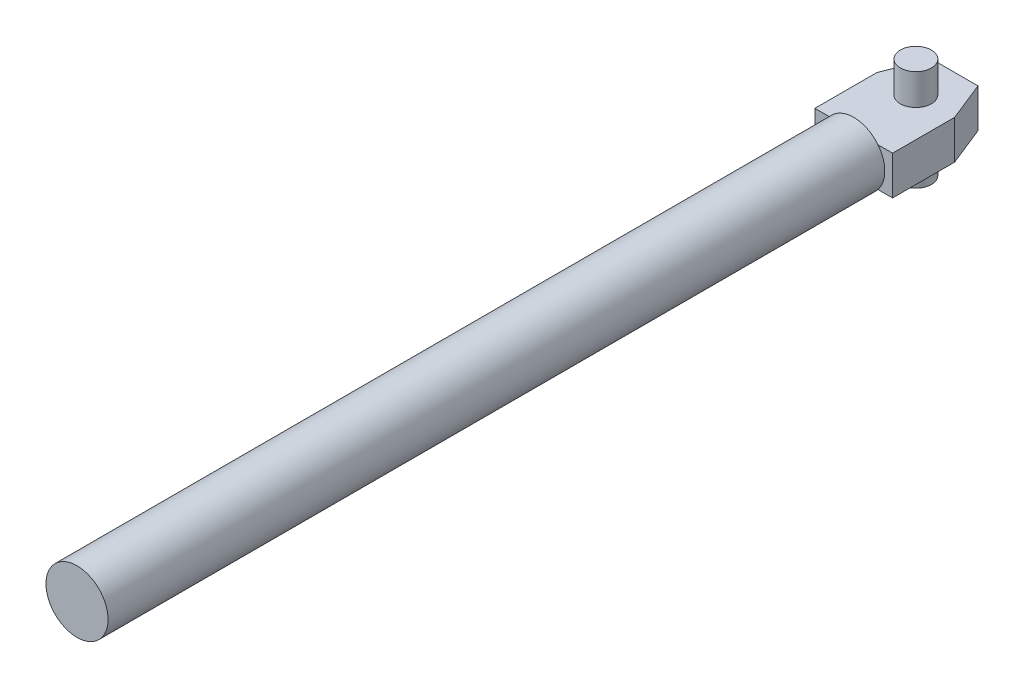
ISO-10303-21;
HEADER;
FILE_DESCRIPTION(('STEP AP214'),'2;1');
FILE_NAME('part.step','',(''),(''),'','','');
FILE_SCHEMA(('AUTOMOTIVE_DESIGN { 1 0 10303 214 1 1 1 1 }'));
ENDSEC;
DATA;
#1=APPLICATION_CONTEXT('core data for automotive mechanical design processes');
#2=APPLICATION_PROTOCOL_DEFINITION('international standard','automotive_design',2000,#1);
#3=PRODUCT_CONTEXT('',#1,'mechanical');
#4=PRODUCT('Part','Part','',(#3));
#5=PRODUCT_RELATED_PRODUCT_CATEGORY('part','',(#4));
#6=PRODUCT_DEFINITION_FORMATION('','',#4);
#7=PRODUCT_DEFINITION_CONTEXT('part definition',#1,'design');
#8=PRODUCT_DEFINITION('design','',#6,#7);
#9=PRODUCT_DEFINITION_SHAPE('','',#8);
#10=(LENGTH_UNIT() NAMED_UNIT(*) SI_UNIT(.MILLI.,.METRE.));
#11=(NAMED_UNIT(*) PLANE_ANGLE_UNIT() SI_UNIT($,.RADIAN.));
#12=(NAMED_UNIT(*) SI_UNIT($,.STERADIAN.) SOLID_ANGLE_UNIT());
#13=UNCERTAINTY_MEASURE_WITH_UNIT(LENGTH_MEASURE(1.E-05),#10,'distance_accuracy_value','');
#14=(GEOMETRIC_REPRESENTATION_CONTEXT(3) GLOBAL_UNCERTAINTY_ASSIGNED_CONTEXT((#13)) GLOBAL_UNIT_ASSIGNED_CONTEXT((#10,
#11,#12)) REPRESENTATION_CONTEXT('',''));
#15=CARTESIAN_POINT('',(0.,0.,0.));
#16=DIRECTION('',(0.,0.,1.));
#17=DIRECTION('',(1.,0.,0.));
#18=AXIS2_PLACEMENT_3D('',#15,#16,#17);
#19=CARTESIAN_POINT('',(0.,0.,0.));
#20=DIRECTION('',(0.,0.,1.));
#21=DIRECTION('',(1.,0.,0.));
#22=AXIS2_PLACEMENT_3D('',#19,#20,#21);
#23=PLANE('',#22);
#24=DIRECTION('',(1.,0.,0.));
#25=VECTOR('',#24,1.);
#26=CARTESIAN_POINT('',(-25.,12.5,0.));
#27=LINE('',#26,#25);
#28=CARTESIAN_POINT('',(-15.612494995996,12.5,0.));
#29=VERTEX_POINT('',#28);
#30=CARTESIAN_POINT('',(15.612494995996,12.5,0.));
#31=VERTEX_POINT('',#30);
#32=EDGE_CURVE('E111',#29,#31,#27,.T.);
#33=ORIENTED_EDGE('',*,*,#32,.F.);
#34=CARTESIAN_POINT('',(0.,0.,0.));
#35=DIRECTION('',(0.,0.,1.));
#36=DIRECTION('',(1.,0.,0.));
#37=AXIS2_PLACEMENT_3D('',#34,#35,#36);
#38=CIRCLE('',#37,20.);
#39=EDGE_CURVE('E129',#31,#29,#38,.T.);
#40=ORIENTED_EDGE('',*,*,#39,.F.);
#41=EDGE_LOOP('',(#33,#40));
#42=FACE_BOUND('',#41,.T.);
#43=ADVANCED_FACE('F35',(#42),#23,.F.);
#44=CARTESIAN_POINT('',(0.,0.,500.));
#45=DIRECTION('',(0.,0.,-1.));
#46=DIRECTION('',(-1.,0.,0.));
#47=AXIS2_PLACEMENT_3D('',#44,#45,#46);
#48=CYLINDRICAL_SURFACE('',#47,20.);
#49=CARTESIAN_POINT('',(0.,0.,500.));
#50=DIRECTION('',(0.,0.,1.));
#51=DIRECTION('',(1.,0.,0.));
#52=AXIS2_PLACEMENT_3D('',#49,#50,#51);
#53=CIRCLE('',#52,20.);
#54=CARTESIAN_POINT('',(20.,0.,500.));
#55=VERTEX_POINT('',#54);
#56=EDGE_CURVE('E135',#55,#55,#53,.T.);
#57=ORIENTED_EDGE('',*,*,#56,.F.);
#58=EDGE_LOOP('',(#57));
#59=FACE_BOUND('',#58,.T.);
#60=ORIENTED_EDGE('',*,*,#39,.T.);
#61=CARTESIAN_POINT('',(-15.612494995996,-12.5,0.));
#62=VERTEX_POINT('',#61);
#63=EDGE_CURVE('E105',#29,#62,#38,.T.);
#64=ORIENTED_EDGE('',*,*,#63,.T.);
#65=CARTESIAN_POINT('',(15.612494995996,-12.5,0.));
#66=VERTEX_POINT('',#65);
#67=EDGE_CURVE('E51',#62,#66,#38,.T.);
#68=ORIENTED_EDGE('',*,*,#67,.T.);
#69=EDGE_CURVE('E125',#66,#31,#38,.T.);
#70=ORIENTED_EDGE('',*,*,#69,.T.);
#71=EDGE_LOOP('',(#60,#64,#68,#70));
#72=FACE_BOUND('',#71,.T.);
#73=ADVANCED_FACE('F37',(#59,#72),#48,.T.);
#74=CARTESIAN_POINT('',(0.,0.,500.));
#75=DIRECTION('',(0.,0.,1.));
#76=DIRECTION('',(1.,0.,0.));
#77=AXIS2_PLACEMENT_3D('',#74,#75,#76);
#78=PLANE('',#77);
#79=ORIENTED_EDGE('',*,*,#56,.T.);
#80=EDGE_LOOP('',(#79));
#81=FACE_BOUND('',#80,.T.);
#82=ADVANCED_FACE('F206',(#81),#78,.T.);
#83=ORIENTED_EDGE('',*,*,#67,.F.);
#84=DIRECTION('',(1.,0.,0.));
#85=VECTOR('',#84,1.);
#86=CARTESIAN_POINT('',(-25.,-12.5,0.));
#87=LINE('',#86,#85);
#88=EDGE_CURVE('E43',#62,#66,#87,.T.);
#89=ORIENTED_EDGE('',*,*,#88,.T.);
#90=EDGE_LOOP('',(#83,#89));
#91=FACE_BOUND('',#90,.T.);
#92=ADVANCED_FACE('F202',(#91),#23,.F.);
#93=CARTESIAN_POINT('',(-25.,12.5,0.));
#94=DIRECTION('',(0.,0.,-1.));
#95=DIRECTION('',(-1.,0.,0.));
#96=AXIS2_PLACEMENT_3D('',#93,#94,#95);
#97=PLANE('',#96);
#98=ORIENTED_EDGE('',*,*,#63,.F.);
#99=CARTESIAN_POINT('',(-25.,12.5,0.));
#100=VERTEX_POINT('',#99);
#101=EDGE_CURVE('E98',#100,#29,#27,.T.);
#102=ORIENTED_EDGE('',*,*,#101,.F.);
#103=DIRECTION('',(0.,-1.,0.));
#104=VECTOR('',#103,1.);
#105=CARTESIAN_POINT('',(-25.,12.5,0.));
#106=LINE('',#105,#104);
#107=CARTESIAN_POINT('',(-25.,-12.5,0.));
#108=VERTEX_POINT('',#107);
#109=EDGE_CURVE('E103',#100,#108,#106,.T.);
#110=ORIENTED_EDGE('',*,*,#109,.T.);
#111=EDGE_CURVE('E151',#108,#62,#87,.T.);
#112=ORIENTED_EDGE('',*,*,#111,.T.);
#113=EDGE_LOOP('',(#98,#102,#110,#112));
#114=FACE_BOUND('',#113,.T.);
#115=ADVANCED_FACE('F100',(#114),#97,.F.);
#116=CARTESIAN_POINT('',(-25.,12.5,0.));
#117=DIRECTION('',(1.,0.,0.));
#118=DIRECTION('',(0.,0.,-1.));
#119=AXIS2_PLACEMENT_3D('',#116,#117,#118);
#120=PLANE('',#119);
#121=DIRECTION('',(0.,0.,1.));
#122=VECTOR('',#121,1.);
#123=CARTESIAN_POINT('',(-25.,-12.5,0.));
#124=LINE('',#123,#122);
#125=CARTESIAN_POINT('',(-25.,-12.5,-40.));
#126=VERTEX_POINT('',#125);
#127=EDGE_CURVE('E124',#126,#108,#124,.T.);
#128=ORIENTED_EDGE('',*,*,#127,.T.);
#129=ORIENTED_EDGE('',*,*,#109,.F.);
#130=DIRECTION('',(0.,0.,1.));
#131=VECTOR('',#130,1.);
#132=CARTESIAN_POINT('',(-25.,12.5,0.));
#133=LINE('',#132,#131);
#134=CARTESIAN_POINT('',(-25.,12.5,-40.));
#135=VERTEX_POINT('',#134);
#136=EDGE_CURVE('E113',#135,#100,#133,.T.);
#137=ORIENTED_EDGE('',*,*,#136,.F.);
#138=DIRECTION('',(0.,-1.,0.));
#139=VECTOR('',#138,1.);
#140=CARTESIAN_POINT('',(-25.,12.5,-40.));
#141=LINE('',#140,#139);
#142=EDGE_CURVE('E168',#135,#126,#141,.T.);
#143=ORIENTED_EDGE('',*,*,#142,.T.);
#144=EDGE_LOOP('',(#128,#129,#137,#143));
#145=FACE_BOUND('',#144,.T.);
#146=ADVANCED_FACE('F122',(#145),#120,.F.);
#147=ORIENTED_EDGE('',*,*,#69,.F.);
#148=CARTESIAN_POINT('',(25.,-12.5,0.));
#149=VERTEX_POINT('',#148);
#150=EDGE_CURVE('E145',#66,#149,#87,.T.);
#151=ORIENTED_EDGE('',*,*,#150,.T.);
#152=DIRECTION('',(0.,-1.,0.));
#153=VECTOR('',#152,1.);
#154=CARTESIAN_POINT('',(25.,12.5,0.));
#155=LINE('',#154,#153);
#156=CARTESIAN_POINT('',(25.,12.5,0.));
#157=VERTEX_POINT('',#156);
#158=EDGE_CURVE('E126',#157,#149,#155,.T.);
#159=ORIENTED_EDGE('',*,*,#158,.F.);
#160=EDGE_CURVE('E109',#31,#157,#27,.T.);
#161=ORIENTED_EDGE('',*,*,#160,.F.);
#162=EDGE_LOOP('',(#147,#151,#159,#161));
#163=FACE_BOUND('',#162,.T.);
#164=ADVANCED_FACE('F143',(#163),#97,.F.);
#165=CARTESIAN_POINT('',(25.,12.5,0.));
#166=DIRECTION('',(-1.,0.,0.));
#167=DIRECTION('',(0.,0.,1.));
#168=AXIS2_PLACEMENT_3D('',#165,#166,#167);
#169=PLANE('',#168);
#170=DIRECTION('',(0.,0.,-1.));
#171=VECTOR('',#170,1.);
#172=CARTESIAN_POINT('',(25.,-12.5,0.));
#173=LINE('',#172,#171);
#174=CARTESIAN_POINT('',(25.,-12.5,-40.));
#175=VERTEX_POINT('',#174);
#176=EDGE_CURVE('E150',#149,#175,#173,.T.);
#177=ORIENTED_EDGE('',*,*,#176,.T.);
#178=DIRECTION('',(0.,-1.,0.));
#179=VECTOR('',#178,1.);
#180=CARTESIAN_POINT('',(25.,12.5,-40.));
#181=LINE('',#180,#179);
#182=CARTESIAN_POINT('',(25.,12.5,-40.));
#183=VERTEX_POINT('',#182);
#184=EDGE_CURVE('E131',#183,#175,#181,.T.);
#185=ORIENTED_EDGE('',*,*,#184,.F.);
#186=DIRECTION('',(0.,0.,-1.));
#187=VECTOR('',#186,1.);
#188=CARTESIAN_POINT('',(25.,12.5,0.));
#189=LINE('',#188,#187);
#190=EDGE_CURVE('E108',#157,#183,#189,.T.);
#191=ORIENTED_EDGE('',*,*,#190,.F.);
#192=ORIENTED_EDGE('',*,*,#158,.T.);
#193=EDGE_LOOP('',(#177,#185,#191,#192));
#194=FACE_BOUND('',#193,.T.);
#195=ADVANCED_FACE('F160',(#194),#169,.F.);
#196=CARTESIAN_POINT('',(15.,12.5,-65.));
#197=DIRECTION('',(-0.928476690885259,0.,0.371390676354104));
#198=DIRECTION('',(0.371390676354104,0.,0.928476690885259));
#199=AXIS2_PLACEMENT_3D('',#196,#197,#198);
#200=PLANE('',#199);
#201=DIRECTION('',(-0.371390676354104,0.,-0.928476690885259));
#202=VECTOR('',#201,1.);
#203=CARTESIAN_POINT('',(15.,-12.5,-65.));
#204=LINE('',#203,#202);
#205=CARTESIAN_POINT('',(15.,-12.5,-65.));
#206=VERTEX_POINT('',#205);
#207=EDGE_CURVE('E181',#175,#206,#204,.T.);
#208=ORIENTED_EDGE('',*,*,#207,.T.);
#209=DIRECTION('',(0.,-1.,0.));
#210=VECTOR('',#209,1.);
#211=CARTESIAN_POINT('',(15.,12.5,-65.));
#212=LINE('',#211,#210);
#213=CARTESIAN_POINT('',(15.,12.5,-65.));
#214=VERTEX_POINT('',#213);
#215=EDGE_CURVE('E172',#214,#206,#212,.T.);
#216=ORIENTED_EDGE('',*,*,#215,.F.);
#217=DIRECTION('',(-0.371390676354104,0.,-0.928476690885259));
#218=VECTOR('',#217,1.);
#219=CARTESIAN_POINT('',(15.,12.5,-65.));
#220=LINE('',#219,#218);
#221=EDGE_CURVE('E163',#183,#214,#220,.T.);
#222=ORIENTED_EDGE('',*,*,#221,.F.);
#223=ORIENTED_EDGE('',*,*,#184,.T.);
#224=EDGE_LOOP('',(#208,#216,#222,#223));
#225=FACE_BOUND('',#224,.T.);
#226=ADVANCED_FACE('F179',(#225),#200,.F.);
#227=CARTESIAN_POINT('',(-15.,12.5,-65.));
#228=DIRECTION('',(0.,0.,1.));
#229=DIRECTION('',(1.,0.,0.));
#230=AXIS2_PLACEMENT_3D('',#227,#228,#229);
#231=PLANE('',#230);
#232=DIRECTION('',(-1.,0.,0.));
#233=VECTOR('',#232,1.);
#234=CARTESIAN_POINT('',(-15.,-12.5,-65.));
#235=LINE('',#234,#233);
#236=CARTESIAN_POINT('',(-15.,-12.5,-65.));
#237=VERTEX_POINT('',#236);
#238=EDGE_CURVE('E184',#206,#237,#235,.T.);
#239=ORIENTED_EDGE('',*,*,#238,.T.);
#240=DIRECTION('',(0.,-1.,0.));
#241=VECTOR('',#240,1.);
#242=CARTESIAN_POINT('',(-15.,12.5,-65.));
#243=LINE('',#242,#241);
#244=CARTESIAN_POINT('',(-15.,12.5,-65.));
#245=VERTEX_POINT('',#244);
#246=EDGE_CURVE('E169',#245,#237,#243,.T.);
#247=ORIENTED_EDGE('',*,*,#246,.F.);
#248=DIRECTION('',(-1.,0.,0.));
#249=VECTOR('',#248,1.);
#250=CARTESIAN_POINT('',(-15.,12.5,-65.));
#251=LINE('',#250,#249);
#252=EDGE_CURVE('E164',#214,#245,#251,.T.);
#253=ORIENTED_EDGE('',*,*,#252,.F.);
#254=ORIENTED_EDGE('',*,*,#215,.T.);
#255=EDGE_LOOP('',(#239,#247,#253,#254));
#256=FACE_BOUND('',#255,.T.);
#257=ADVANCED_FACE('F191',(#256),#231,.F.);
#258=CARTESIAN_POINT('',(-25.,12.5,-40.));
#259=DIRECTION('',(0.928476690885259,0.,0.371390676354104));
#260=DIRECTION('',(0.371390676354104,0.,-0.928476690885259));
#261=AXIS2_PLACEMENT_3D('',#258,#259,#260);
#262=PLANE('',#261);
#263=DIRECTION('',(-0.371390676354104,0.,0.928476690885259));
#264=VECTOR('',#263,1.);
#265=CARTESIAN_POINT('',(-25.,-12.5,-40.));
#266=LINE('',#265,#264);
#267=EDGE_CURVE('E120',#237,#126,#266,.T.);
#268=ORIENTED_EDGE('',*,*,#267,.T.);
#269=ORIENTED_EDGE('',*,*,#142,.F.);
#270=DIRECTION('',(-0.371390676354104,0.,0.928476690885259));
#271=VECTOR('',#270,1.);
#272=CARTESIAN_POINT('',(-25.,12.5,-40.));
#273=LINE('',#272,#271);
#274=EDGE_CURVE('E116',#245,#135,#273,.T.);
#275=ORIENTED_EDGE('',*,*,#274,.F.);
#276=ORIENTED_EDGE('',*,*,#246,.T.);
#277=EDGE_LOOP('',(#268,#269,#275,#276));
#278=FACE_BOUND('',#277,.T.);
#279=ADVANCED_FACE('F189',(#278),#262,.F.);
#280=CARTESIAN_POINT('',(0.,12.5,0.));
#281=DIRECTION('',(0.,-1.,0.));
#282=DIRECTION('',(0.,0.,-1.));
#283=AXIS2_PLACEMENT_3D('',#280,#281,#282);
#284=PLANE('',#283);
#285=CARTESIAN_POINT('',(0.,12.5,-40.));
#286=DIRECTION('',(0.,-1.,0.));
#287=DIRECTION('',(0.,0.,-1.));
#288=AXIS2_PLACEMENT_3D('',#285,#286,#287);
#289=CIRCLE('',#288,10.);
#290=CARTESIAN_POINT('',(0.,12.5,-30.));
#291=VERTEX_POINT('',#290);
#292=EDGE_CURVE('E153',#291,#291,#289,.T.);
#293=ORIENTED_EDGE('',*,*,#292,.T.);
#294=EDGE_LOOP('',(#293));
#295=FACE_BOUND('',#294,.T.);
#296=ORIENTED_EDGE('',*,*,#136,.T.);
#297=ORIENTED_EDGE('',*,*,#101,.T.);
#298=ORIENTED_EDGE('',*,*,#32,.T.);
#299=ORIENTED_EDGE('',*,*,#160,.T.);
#300=ORIENTED_EDGE('',*,*,#190,.T.);
#301=ORIENTED_EDGE('',*,*,#221,.T.);
#302=ORIENTED_EDGE('',*,*,#252,.T.);
#303=ORIENTED_EDGE('',*,*,#274,.T.);
#304=EDGE_LOOP('',(#296,#297,#298,#299,#300,#301,#302,#303));
#305=FACE_BOUND('',#304,.T.);
#306=ADVANCED_FACE('F114',(#295,#305),#284,.F.);
#307=CARTESIAN_POINT('',(0.,-12.5,0.));
#308=DIRECTION('',(0.,-1.,0.));
#309=DIRECTION('',(0.,0.,-1.));
#310=AXIS2_PLACEMENT_3D('',#307,#308,#309);
#311=PLANE('',#310);
#312=CARTESIAN_POINT('',(0.,-12.5,-40.));
#313=DIRECTION('',(0.,-1.,0.));
#314=DIRECTION('',(0.,0.,-1.));
#315=AXIS2_PLACEMENT_3D('',#312,#313,#314);
#316=CIRCLE('',#315,10.);
#317=CARTESIAN_POINT('',(0.,-12.5,-30.));
#318=VERTEX_POINT('',#317);
#319=EDGE_CURVE('E11',#318,#318,#316,.T.);
#320=ORIENTED_EDGE('',*,*,#319,.F.);
#321=EDGE_LOOP('',(#320));
#322=FACE_BOUND('',#321,.T.);
#323=ORIENTED_EDGE('',*,*,#127,.F.);
#324=ORIENTED_EDGE('',*,*,#267,.F.);
#325=ORIENTED_EDGE('',*,*,#238,.F.);
#326=ORIENTED_EDGE('',*,*,#207,.F.);
#327=ORIENTED_EDGE('',*,*,#176,.F.);
#328=ORIENTED_EDGE('',*,*,#150,.F.);
#329=ORIENTED_EDGE('',*,*,#88,.F.);
#330=ORIENTED_EDGE('',*,*,#111,.F.);
#331=EDGE_LOOP('',(#323,#324,#325,#326,#327,#328,#329,#330));
#332=FACE_BOUND('',#331,.T.);
#333=ADVANCED_FACE('F148',(#322,#332),#311,.T.);
#334=CARTESIAN_POINT('',(0.,-32.5,-40.));
#335=DIRECTION('',(0.,1.,0.));
#336=DIRECTION('',(0.,0.,1.));
#337=AXIS2_PLACEMENT_3D('',#334,#335,#336);
#338=PLANE('',#337);
#339=CARTESIAN_POINT('',(0.,-32.5,-40.));
#340=DIRECTION('',(0.,1.,0.));
#341=DIRECTION('',(0.,0.,1.));
#342=AXIS2_PLACEMENT_3D('',#339,#340,#341);
#343=CIRCLE('',#342,10.);
#344=CARTESIAN_POINT('',(0.,-32.5,-30.));
#345=VERTEX_POINT('',#344);
#346=EDGE_CURVE('E353',#345,#345,#343,.T.);
#347=ORIENTED_EDGE('',*,*,#346,.F.);
#348=EDGE_LOOP('',(#347));
#349=FACE_BOUND('',#348,.T.);
#350=ADVANCED_FACE('F263',(#349),#338,.F.);
#351=CARTESIAN_POINT('',(0.,-32.5,-40.));
#352=DIRECTION('',(0.,1.,0.));
#353=DIRECTION('',(0.,0.,1.));
#354=AXIS2_PLACEMENT_3D('',#351,#352,#353);
#355=CYLINDRICAL_SURFACE('',#354,10.);
#356=CARTESIAN_POINT('',(0.,-12.5,-30.));
#357=CARTESIAN_POINT('',(0.,-12.7083333333333,-30.));
#358=CARTESIAN_POINT('',(0.,-12.9166666666667,-30.));
#359=CARTESIAN_POINT('',(0.,-13.3333333333333,-30.));
#360=CARTESIAN_POINT('',(0.,-13.5416666666667,-30.));
#361=CARTESIAN_POINT('',(0.,-13.9583333333333,-30.));
#362=CARTESIAN_POINT('',(0.,-14.1666666666667,-30.));
#363=CARTESIAN_POINT('',(0.,-14.5833333333333,-30.));
#364=CARTESIAN_POINT('',(0.,-14.7916666666667,-30.));
#365=CARTESIAN_POINT('',(0.,-15.2083333333333,-30.));
#366=CARTESIAN_POINT('',(0.,-15.4166666666667,-30.));
#367=CARTESIAN_POINT('',(0.,-15.8333333333333,-30.));
#368=CARTESIAN_POINT('',(0.,-16.0416666666667,-30.));
#369=CARTESIAN_POINT('',(0.,-16.4583333333333,-30.));
#370=CARTESIAN_POINT('',(0.,-16.6666666666667,-30.));
#371=CARTESIAN_POINT('',(0.,-17.0833333333333,-30.));
#372=CARTESIAN_POINT('',(0.,-17.2916666666667,-30.));
#373=CARTESIAN_POINT('',(0.,-17.7083333333333,-30.));
#374=CARTESIAN_POINT('',(0.,-17.9166666666667,-30.));
#375=CARTESIAN_POINT('',(0.,-18.3333333333333,-30.));
#376=CARTESIAN_POINT('',(0.,-18.5416666666667,-30.));
#377=CARTESIAN_POINT('',(0.,-18.9583333333333,-30.));
#378=CARTESIAN_POINT('',(0.,-19.1666666666667,-30.));
#379=CARTESIAN_POINT('',(0.,-19.5833333333333,-30.));
#380=CARTESIAN_POINT('',(0.,-19.7916666666667,-30.));
#381=CARTESIAN_POINT('',(0.,-20.2083333333333,-30.));
#382=CARTESIAN_POINT('',(0.,-20.4166666666667,-30.));
#383=CARTESIAN_POINT('',(0.,-20.8333333333333,-30.));
#384=CARTESIAN_POINT('',(0.,-21.0416666666667,-30.));
#385=CARTESIAN_POINT('',(0.,-21.4583333333333,-30.));
#386=CARTESIAN_POINT('',(0.,-21.6666666666667,-30.));
#387=CARTESIAN_POINT('',(0.,-22.0833333333333,-30.));
#388=CARTESIAN_POINT('',(0.,-22.2916666666667,-30.));
#389=CARTESIAN_POINT('',(0.,-22.7083333333333,-30.));
#390=CARTESIAN_POINT('',(0.,-22.9166666666667,-30.));
#391=CARTESIAN_POINT('',(0.,-23.3333333333333,-30.));
#392=CARTESIAN_POINT('',(0.,-23.5416666666667,-30.));
#393=CARTESIAN_POINT('',(0.,-23.9583333333333,-30.));
#394=CARTESIAN_POINT('',(0.,-24.1666666666667,-30.));
#395=CARTESIAN_POINT('',(0.,-24.5833333333333,-30.));
#396=CARTESIAN_POINT('',(0.,-24.7916666666667,-30.));
#397=CARTESIAN_POINT('',(0.,-25.2083333333333,-30.));
#398=CARTESIAN_POINT('',(0.,-25.4166666666667,-30.));
#399=CARTESIAN_POINT('',(0.,-25.8333333333333,-30.));
#400=CARTESIAN_POINT('',(0.,-26.0416666666667,-30.));
#401=CARTESIAN_POINT('',(0.,-26.4583333333333,-30.));
#402=CARTESIAN_POINT('',(0.,-26.6666666666667,-30.));
#403=CARTESIAN_POINT('',(0.,-27.0833333333333,-30.));
#404=CARTESIAN_POINT('',(0.,-27.2916666666667,-30.));
#405=CARTESIAN_POINT('',(0.,-27.7083333333333,-30.));
#406=CARTESIAN_POINT('',(0.,-27.9166666666667,-30.));
#407=CARTESIAN_POINT('',(0.,-28.3333333333333,-30.));
#408=CARTESIAN_POINT('',(0.,-28.5416666666667,-30.));
#409=CARTESIAN_POINT('',(0.,-28.9583333333333,-30.));
#410=CARTESIAN_POINT('',(0.,-29.1666666666667,-30.));
#411=CARTESIAN_POINT('',(0.,-29.5833333333333,-30.));
#412=CARTESIAN_POINT('',(0.,-29.7916666666667,-30.));
#413=CARTESIAN_POINT('',(0.,-30.2083333333333,-30.));
#414=CARTESIAN_POINT('',(0.,-30.4166666666667,-30.));
#415=CARTESIAN_POINT('',(0.,-30.8333333333333,-30.));
#416=CARTESIAN_POINT('',(0.,-31.0416666666667,-30.));
#417=CARTESIAN_POINT('',(0.,-31.4583333333333,-30.));
#418=CARTESIAN_POINT('',(0.,-31.6666666666667,-30.));
#419=CARTESIAN_POINT('',(0.,-32.0833333333333,-30.));
#420=CARTESIAN_POINT('',(0.,-32.2916666666667,-30.));
#421=CARTESIAN_POINT('',(0.,-32.5,-30.));
#422=B_SPLINE_CURVE_WITH_KNOTS('',3,(#356,#357,#358,#359,#360,#361,#362,#363,#364,#365,#366,
#367,#368,#369,#370,#371,#372,#373,#374,#375,#376,#377,#378,#379,#380,#381,#382,#383,#384,#385,
#386,#387,#388,#389,#390,#391,#392,#393,#394,#395,#396,#397,#398,#399,#400,#401,#402,#403,#404,
#405,#406,#407,#408,#409,#410,#411,#412,#413,#414,#415,#416,#417,#418,#419,#420,#421),
.UNSPECIFIED.,.F.,.F.,(4,2,2,2,2,2,2,2,2,2,2,2,2,2,2,2,2,2,2,2,2,2,2,2,2,2,2,2,2,2,2,2,4),(0.,
0.625000000000001,1.25,1.875,2.5,3.125,3.75,4.375,5.,5.625,6.25,6.875,7.5,8.125,8.75,9.375,10.,
10.625,11.25,11.875,12.5,13.125,13.75,14.375,15.,15.625,16.25,16.875,17.5,18.125,18.75,19.375,
20.),.UNSPECIFIED.);
#423=EDGE_CURVE('BSEAM271',#318,#345,#422,.T.);
#424=ORIENTED_EDGE('',*,*,#319,.T.);
#425=ORIENTED_EDGE('',*,*,#346,.T.);
#426=ORIENTED_EDGE('',*,*,#423,.T.);
#427=ORIENTED_EDGE('',*,*,#423,.F.);
#428=EDGE_LOOP('',(#424,#426,#425,#427));
#429=FACE_BOUND('',#428,.T.);
#430=ADVANCED_FACE('F271',(#429),#355,.T.);
#431=CARTESIAN_POINT('',(0.,32.5,-40.));
#432=DIRECTION('',(0.,1.,0.));
#433=DIRECTION('',(0.,0.,1.));
#434=AXIS2_PLACEMENT_3D('',#431,#432,#433);
#435=CIRCLE('',#434,10.);
#436=CARTESIAN_POINT('',(0.,32.5,-30.));
#437=VERTEX_POINT('',#436);
#438=EDGE_CURVE('E352',#437,#437,#435,.T.);
#439=CARTESIAN_POINT('',(0.,32.5,-30.));
#440=CARTESIAN_POINT('',(0.,32.2916666666666,-30.));
#441=CARTESIAN_POINT('',(0.,32.0833333333333,-30.));
#442=CARTESIAN_POINT('',(0.,31.6666666666666,-30.));
#443=CARTESIAN_POINT('',(0.,31.4583333333333,-30.));
#444=CARTESIAN_POINT('',(0.,31.0416666666666,-30.));
#445=CARTESIAN_POINT('',(0.,30.8333333333333,-30.));
#446=CARTESIAN_POINT('',(0.,30.4166666666666,-30.));
#447=CARTESIAN_POINT('',(0.,30.2083333333333,-30.));
#448=CARTESIAN_POINT('',(0.,29.7916666666666,-30.));
#449=CARTESIAN_POINT('',(0.,29.5833333333333,-30.));
#450=CARTESIAN_POINT('',(0.,29.1666666666666,-30.));
#451=CARTESIAN_POINT('',(0.,28.9583333333333,-30.));
#452=CARTESIAN_POINT('',(0.,28.5416666666666,-30.));
#453=CARTESIAN_POINT('',(0.,28.3333333333333,-30.));
#454=CARTESIAN_POINT('',(0.,27.9166666666666,-30.));
#455=CARTESIAN_POINT('',(0.,27.7083333333333,-30.));
#456=CARTESIAN_POINT('',(0.,27.2916666666666,-30.));
#457=CARTESIAN_POINT('',(0.,27.0833333333333,-30.));
#458=CARTESIAN_POINT('',(0.,26.6666666666666,-30.));
#459=CARTESIAN_POINT('',(0.,26.4583333333333,-30.));
#460=CARTESIAN_POINT('',(0.,26.0416666666666,-30.));
#461=CARTESIAN_POINT('',(0.,25.8333333333333,-30.));
#462=CARTESIAN_POINT('',(0.,25.4166666666666,-30.));
#463=CARTESIAN_POINT('',(0.,25.2083333333333,-30.));
#464=CARTESIAN_POINT('',(0.,24.7916666666666,-30.));
#465=CARTESIAN_POINT('',(0.,24.5833333333333,-30.));
#466=CARTESIAN_POINT('',(0.,24.1666666666667,-30.));
#467=CARTESIAN_POINT('',(0.,23.9583333333333,-30.));
#468=CARTESIAN_POINT('',(0.,23.5416666666667,-30.));
#469=CARTESIAN_POINT('',(0.,23.3333333333333,-30.));
#470=CARTESIAN_POINT('',(0.,22.9166666666667,-30.));
#471=CARTESIAN_POINT('',(0.,22.7083333333333,-30.));
#472=CARTESIAN_POINT('',(0.,22.2916666666667,-30.));
#473=CARTESIAN_POINT('',(0.,22.0833333333333,-30.));
#474=CARTESIAN_POINT('',(0.,21.6666666666667,-30.));
#475=CARTESIAN_POINT('',(0.,21.4583333333333,-30.));
#476=CARTESIAN_POINT('',(0.,21.0416666666667,-30.));
#477=CARTESIAN_POINT('',(0.,20.8333333333333,-30.));
#478=CARTESIAN_POINT('',(0.,20.4166666666667,-30.));
#479=CARTESIAN_POINT('',(0.,20.2083333333333,-30.));
#480=CARTESIAN_POINT('',(0.,19.7916666666667,-30.));
#481=CARTESIAN_POINT('',(0.,19.5833333333333,-30.));
#482=CARTESIAN_POINT('',(0.,19.1666666666667,-30.));
#483=CARTESIAN_POINT('',(0.,18.9583333333333,-30.));
#484=CARTESIAN_POINT('',(0.,18.5416666666667,-30.));
#485=CARTESIAN_POINT('',(0.,18.3333333333333,-30.));
#486=CARTESIAN_POINT('',(0.,17.9166666666667,-30.));
#487=CARTESIAN_POINT('',(0.,17.7083333333333,-30.));
#488=CARTESIAN_POINT('',(0.,17.2916666666667,-30.));
#489=CARTESIAN_POINT('',(0.,17.0833333333333,-30.));
#490=CARTESIAN_POINT('',(0.,16.6666666666667,-30.));
#491=CARTESIAN_POINT('',(0.,16.4583333333333,-30.));
#492=CARTESIAN_POINT('',(0.,16.0416666666667,-30.));
#493=CARTESIAN_POINT('',(0.,15.8333333333333,-30.));
#494=CARTESIAN_POINT('',(0.,15.4166666666667,-30.));
#495=CARTESIAN_POINT('',(0.,15.2083333333333,-30.));
#496=CARTESIAN_POINT('',(0.,14.7916666666667,-30.));
#497=CARTESIAN_POINT('',(0.,14.5833333333333,-30.));
#498=CARTESIAN_POINT('',(0.,14.1666666666667,-30.));
#499=CARTESIAN_POINT('',(0.,13.9583333333333,-30.));
#500=CARTESIAN_POINT('',(0.,13.5416666666667,-30.));
#501=CARTESIAN_POINT('',(0.,13.3333333333333,-30.));
#502=CARTESIAN_POINT('',(0.,12.9166666666667,-30.));
#503=CARTESIAN_POINT('',(0.,12.7083333333333,-30.));
#504=CARTESIAN_POINT('',(0.,12.5,-30.));
#505=B_SPLINE_CURVE_WITH_KNOTS('',3,(#439,#440,#441,#442,#443,#444,#445,#446,#447,#448,#449,
#450,#451,#452,#453,#454,#455,#456,#457,#458,#459,#460,#461,#462,#463,#464,#465,#466,#467,#468,
#469,#470,#471,#472,#473,#474,#475,#476,#477,#478,#479,#480,#481,#482,#483,#484,#485,#486,#487,
#488,#489,#490,#491,#492,#493,#494,#495,#496,#497,#498,#499,#500,#501,#502,#503,#504),
.UNSPECIFIED.,.F.,.F.,(4,2,2,2,2,2,2,2,2,2,2,2,2,2,2,2,2,2,2,2,2,2,2,2,2,2,2,2,2,2,2,2,4),(0.,
0.625000000000001,1.25,1.875,2.49999999999999,3.12499999999999,3.74999999999998,
4.37499999999998,4.99999999999998,5.62499999999998,6.24999999999998,6.87499999999998,
7.49999999999998,8.12499999999998,8.74999999999997,9.37499999999997,9.99999999999997,10.625,
11.25,11.875,12.5,13.125,13.75,14.375,15.,15.625,16.25,16.875,17.5,18.125,18.75,19.375,20.),.UNSPECIFIED.);
#506=EDGE_CURVE('BSEAM279',#437,#291,#505,.T.);
#507=ORIENTED_EDGE('',*,*,#438,.F.);
#508=ORIENTED_EDGE('',*,*,#292,.F.);
#509=ORIENTED_EDGE('',*,*,#506,.T.);
#510=ORIENTED_EDGE('',*,*,#506,.F.);
#511=EDGE_LOOP('',(#507,#509,#508,#510));
#512=FACE_BOUND('',#511,.T.);
#513=ADVANCED_FACE('F279',(#512),#355,.T.);
#514=CARTESIAN_POINT('',(0.,32.5,-40.));
#515=DIRECTION('',(0.,1.,0.));
#516=DIRECTION('',(0.,0.,1.));
#517=AXIS2_PLACEMENT_3D('',#514,#515,#516);
#518=PLANE('',#517);
#519=ORIENTED_EDGE('',*,*,#438,.T.);
#520=EDGE_LOOP('',(#519));
#521=FACE_BOUND('',#520,.T.);
#522=ADVANCED_FACE('F287',(#521),#518,.T.);
#523=CLOSED_SHELL('',(#43,#73,#82,#92,#115,#146,#164,#195,#226,#257,#279,#306,#333,#350,#430,
#513,#522));
#524=MANIFOLD_SOLID_BREP('B2',#523);
#525=ADVANCED_BREP_SHAPE_REPRESENTATION('',(#18,#524),#14);
#526=SHAPE_DEFINITION_REPRESENTATION(#9,#525);
ENDSEC;
END-ISO-10303-21;
